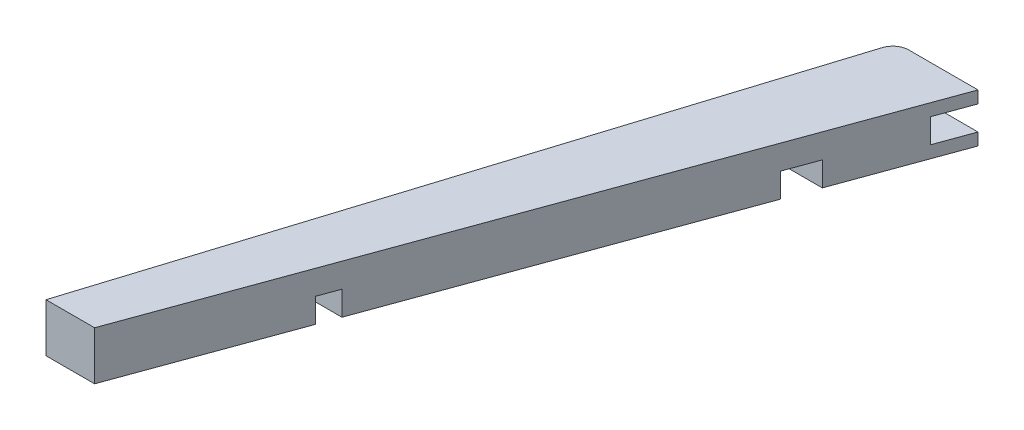
ISO-10303-21;
HEADER;
FILE_DESCRIPTION(('STEP AP214'),'2;1');
FILE_NAME('part.step','',(''),(''),'','','');
FILE_SCHEMA(('AUTOMOTIVE_DESIGN { 1 0 10303 214 1 1 1 1 }'));
ENDSEC;
DATA;
#1=APPLICATION_CONTEXT('core data for automotive mechanical design processes');
#2=APPLICATION_PROTOCOL_DEFINITION('international standard','automotive_design',2000,#1);
#3=PRODUCT_CONTEXT('',#1,'mechanical');
#4=PRODUCT('Part','Part','',(#3));
#5=PRODUCT_RELATED_PRODUCT_CATEGORY('part','',(#4));
#6=PRODUCT_DEFINITION_FORMATION('','',#4);
#7=PRODUCT_DEFINITION_CONTEXT('part definition',#1,'design');
#8=PRODUCT_DEFINITION('design','',#6,#7);
#9=PRODUCT_DEFINITION_SHAPE('','',#8);
#10=(LENGTH_UNIT() NAMED_UNIT(*) SI_UNIT(.MILLI.,.METRE.));
#11=(NAMED_UNIT(*) PLANE_ANGLE_UNIT() SI_UNIT($,.RADIAN.));
#12=(NAMED_UNIT(*) SI_UNIT($,.STERADIAN.) SOLID_ANGLE_UNIT());
#13=UNCERTAINTY_MEASURE_WITH_UNIT(LENGTH_MEASURE(1.E-05),#10,'distance_accuracy_value','');
#14=(GEOMETRIC_REPRESENTATION_CONTEXT(3) GLOBAL_UNCERTAINTY_ASSIGNED_CONTEXT((#13)) GLOBAL_UNIT_ASSIGNED_CONTEXT((#10,
#11,#12)) REPRESENTATION_CONTEXT('',''));
#15=CARTESIAN_POINT('',(0.,0.,0.));
#16=DIRECTION('',(0.,0.,1.));
#17=DIRECTION('',(1.,0.,0.));
#18=AXIS2_PLACEMENT_3D('',#15,#16,#17);
#19=CARTESIAN_POINT('',(-15.,15.,0.));
#20=DIRECTION('',(0.,0.,-1.));
#21=DIRECTION('',(-1.,0.,0.));
#22=AXIS2_PLACEMENT_3D('',#19,#20,#21);
#23=PLANE('',#22);
#24=DIRECTION('',(1.,0.,0.));
#25=VECTOR('',#24,1.);
#26=CARTESIAN_POINT('',(-15.,-15.,0.));
#27=LINE('',#26,#25);
#28=CARTESIAN_POINT('',(-15.,-15.,0.));
#29=VERTEX_POINT('',#28);
#30=CARTESIAN_POINT('',(15.,-15.,0.));
#31=VERTEX_POINT('',#30);
#32=EDGE_CURVE('E231',#29,#31,#27,.T.);
#33=ORIENTED_EDGE('',*,*,#32,.T.);
#34=DIRECTION('',(0.,-1.,0.));
#35=VECTOR('',#34,1.);
#36=CARTESIAN_POINT('',(15.,15.,0.));
#37=LINE('',#36,#35);
#38=CARTESIAN_POINT('',(15.,15.,0.));
#39=VERTEX_POINT('',#38);
#40=EDGE_CURVE('E261',#39,#31,#37,.T.);
#41=ORIENTED_EDGE('',*,*,#40,.F.);
#42=DIRECTION('',(1.,0.,0.));
#43=VECTOR('',#42,1.);
#44=CARTESIAN_POINT('',(-15.,15.,0.));
#45=LINE('',#44,#43);
#46=CARTESIAN_POINT('',(-15.,15.,0.));
#47=VERTEX_POINT('',#46);
#48=EDGE_CURVE('E232',#47,#39,#45,.T.);
#49=ORIENTED_EDGE('',*,*,#48,.F.);
#50=DIRECTION('',(0.,-1.,0.));
#51=VECTOR('',#50,1.);
#52=CARTESIAN_POINT('',(-15.,15.,0.));
#53=LINE('',#52,#51);
#54=EDGE_CURVE('E243',#47,#29,#53,.T.);
#55=ORIENTED_EDGE('',*,*,#54,.T.);
#56=EDGE_LOOP('',(#33,#41,#49,#55));
#57=FACE_BOUND('',#56,.T.);
#58=ADVANCED_FACE('F34',(#57),#23,.F.);
#59=CARTESIAN_POINT('',(15.,15.,0.));
#60=DIRECTION('',(-0.939692620785907,0.,-0.342020143325673));
#61=DIRECTION('',(-0.342020143325673,0.,0.939692620785907));
#62=AXIS2_PLACEMENT_3D('',#59,#60,#61);
#63=PLANE('',#62);
#64=DIRECTION('',(0.342020143325673,0.,-0.939692620785907));
#65=VECTOR('',#64,1.);
#66=CARTESIAN_POINT('',(15.,-15.,0.));
#67=LINE('',#66,#65);
#68=CARTESIAN_POINT('',(51.3970234266207,-15.,-100.));
#69=VERTEX_POINT('',#68);
#70=EDGE_CURVE('E247',#31,#69,#67,.T.);
#71=ORIENTED_EDGE('',*,*,#70,.T.);
#72=DIRECTION('',(0.,1.,0.));
#73=VECTOR('',#72,1.);
#74=CARTESIAN_POINT('',(51.3970234266207,15.,-100.));
#75=LINE('',#74,#73);
#76=CARTESIAN_POINT('',(51.3970234266207,0.,-100.));
#77=VERTEX_POINT('',#76);
#78=EDGE_CURVE('E202',#69,#77,#75,.T.);
#79=ORIENTED_EDGE('',*,*,#78,.T.);
#80=DIRECTION('',(-0.342020143325673,0.,0.939692620785907));
#81=VECTOR('',#80,1.);
#82=CARTESIAN_POINT('',(15.,0.,0.));
#83=LINE('',#82,#81);
#84=CARTESIAN_POINT('',(55.7646662378152,0.,-112.));
#85=VERTEX_POINT('',#84);
#86=EDGE_CURVE('E11',#85,#77,#83,.T.);
#87=ORIENTED_EDGE('',*,*,#86,.F.);
#88=DIRECTION('',(0.,-1.,0.));
#89=VECTOR('',#88,1.);
#90=CARTESIAN_POINT('',(55.7646662378152,15.,-112.));
#91=LINE('',#90,#89);
#92=CARTESIAN_POINT('',(55.7646662378152,-15.,-112.));
#93=VERTEX_POINT('',#92);
#94=EDGE_CURVE('E166',#85,#93,#91,.T.);
#95=ORIENTED_EDGE('',*,*,#94,.T.);
#96=CARTESIAN_POINT('',(128.012757739657,-15.,-310.5));
#97=VERTEX_POINT('',#96);
#98=EDGE_CURVE('E251',#93,#97,#67,.T.);
#99=ORIENTED_EDGE('',*,*,#98,.T.);
#100=DIRECTION('',(0.,1.,0.));
#101=VECTOR('',#100,1.);
#102=CARTESIAN_POINT('',(128.012757739657,15.,-310.5));
#103=LINE('',#102,#101);
#104=CARTESIAN_POINT('',(128.012757739657,0.,-310.5));
#105=VERTEX_POINT('',#104);
#106=EDGE_CURVE('E198',#97,#105,#103,.T.);
#107=ORIENTED_EDGE('',*,*,#106,.T.);
#108=DIRECTION('',(-0.342020143325673,0.,0.939692620785907));
#109=VECTOR('',#108,1.);
#110=CARTESIAN_POINT('',(15.,0.,0.));
#111=LINE('',#110,#109);
#112=CARTESIAN_POINT('',(134.928192190715,0.,-329.5));
#113=VERTEX_POINT('',#112);
#114=EDGE_CURVE('E42',#113,#105,#111,.T.);
#115=ORIENTED_EDGE('',*,*,#114,.F.);
#116=DIRECTION('',(0.,-1.,0.));
#117=VECTOR('',#116,1.);
#118=CARTESIAN_POINT('',(134.928192190715,15.,-329.5));
#119=LINE('',#118,#117);
#120=CARTESIAN_POINT('',(134.928192190715,-15.,-329.5));
#121=VERTEX_POINT('',#120);
#122=EDGE_CURVE('E180',#113,#121,#119,.T.);
#123=ORIENTED_EDGE('',*,*,#122,.T.);
#124=CARTESIAN_POINT('',(160.588093706483,-15.,-400.));
#125=VERTEX_POINT('',#124);
#126=EDGE_CURVE('E246',#121,#125,#67,.T.);
#127=ORIENTED_EDGE('',*,*,#126,.T.);
#128=DIRECTION('',(0.,-1.,0.));
#129=VECTOR('',#128,1.);
#130=CARTESIAN_POINT('',(160.588093706483,15.,-400.));
#131=LINE('',#130,#129);
#132=CARTESIAN_POINT('',(160.588093706483,-7.5,-400.));
#133=VERTEX_POINT('',#132);
#134=EDGE_CURVE('E257',#133,#125,#131,.T.);
#135=ORIENTED_EDGE('',*,*,#134,.F.);
#136=DIRECTION('',(-0.342020143325673,0.,0.939692620785907));
#137=VECTOR('',#136,1.);
#138=CARTESIAN_POINT('',(15.,-7.5,0.));
#139=LINE('',#138,#137);
#140=CARTESIAN_POINT('',(152.744535158046,-7.5,-378.45));
#141=VERTEX_POINT('',#140);
#142=EDGE_CURVE('E224',#133,#141,#139,.T.);
#143=ORIENTED_EDGE('',*,*,#142,.T.);
#144=DIRECTION('',(0.,-1.,0.));
#145=VECTOR('',#144,1.);
#146=CARTESIAN_POINT('',(152.744535158046,15.,-378.45));
#147=LINE('',#146,#145);
#148=CARTESIAN_POINT('',(152.744535158046,7.5,-378.45));
#149=VERTEX_POINT('',#148);
#150=EDGE_CURVE('E264',#149,#141,#147,.T.);
#151=ORIENTED_EDGE('',*,*,#150,.F.);
#152=DIRECTION('',(0.342020143325673,0.,-0.939692620785907));
#153=VECTOR('',#152,1.);
#154=CARTESIAN_POINT('',(15.,7.5,0.));
#155=LINE('',#154,#153);
#156=CARTESIAN_POINT('',(160.588093706483,7.5,-400.));
#157=VERTEX_POINT('',#156);
#158=EDGE_CURVE('E228',#149,#157,#155,.T.);
#159=ORIENTED_EDGE('',*,*,#158,.T.);
#160=CARTESIAN_POINT('',(160.588093706483,15.,-400.));
#161=VERTEX_POINT('',#160);
#162=EDGE_CURVE('E258',#161,#157,#131,.T.);
#163=ORIENTED_EDGE('',*,*,#162,.F.);
#164=DIRECTION('',(0.342020143325673,0.,-0.939692620785907));
#165=VECTOR('',#164,1.);
#166=CARTESIAN_POINT('',(15.,15.,0.));
#167=LINE('',#166,#165);
#168=EDGE_CURVE('E235',#39,#161,#167,.T.);
#169=ORIENTED_EDGE('',*,*,#168,.F.);
#170=ORIENTED_EDGE('',*,*,#40,.T.);
#171=EDGE_LOOP('',(#71,#79,#87,#95,#99,#107,#115,#123,#127,#135,#143,#151,#159,#163,#169,#170));
#172=FACE_BOUND('',#171,.T.);
#173=ADVANCED_FACE('F290',(#172),#63,.F.);
#174=CARTESIAN_POINT('',(160.588093706483,15.,-400.));
#175=DIRECTION('',(0.,0.,1.));
#176=DIRECTION('',(1.,0.,0.));
#177=AXIS2_PLACEMENT_3D('',#174,#175,#176);
#178=PLANE('',#177);
#179=DIRECTION('',(-1.,0.,0.));
#180=VECTOR('',#179,1.);
#181=CARTESIAN_POINT('',(160.588093706483,-15.,-400.));
#182=LINE('',#181,#180);
#183=CARTESIAN_POINT('',(117.929695233117,-15.,-400.));
#184=VERTEX_POINT('',#183);
#185=EDGE_CURVE('E250',#125,#184,#182,.T.);
#186=ORIENTED_EDGE('',*,*,#185,.T.);
#187=DIRECTION('',(0.,-1.,0.));
#188=VECTOR('',#187,1.);
#189=CARTESIAN_POINT('',(117.929695233117,15.,-400.));
#190=LINE('',#189,#188);
#191=CARTESIAN_POINT('',(117.929695233117,15.,-400.));
#192=VERTEX_POINT('',#191);
#193=EDGE_CURVE('E271',#184,#192,#190,.F.);
#194=ORIENTED_EDGE('',*,*,#193,.T.);
#195=DIRECTION('',(-1.,0.,0.));
#196=VECTOR('',#195,1.);
#197=CARTESIAN_POINT('',(160.588093706483,15.,-400.));
#198=LINE('',#197,#196);
#199=EDGE_CURVE('E238',#161,#192,#198,.T.);
#200=ORIENTED_EDGE('',*,*,#199,.F.);
#201=ORIENTED_EDGE('',*,*,#162,.T.);
#202=DIRECTION('',(1.,0.,0.));
#203=VECTOR('',#202,1.);
#204=CARTESIAN_POINT('',(160.588093706483,7.5,-400.));
#205=LINE('',#204,#203);
#206=CARTESIAN_POINT('',(135.588093706483,7.5,-400.));
#207=VERTEX_POINT('',#206);
#208=EDGE_CURVE('E209',#207,#157,#205,.T.);
#209=ORIENTED_EDGE('',*,*,#208,.F.);
#210=DIRECTION('',(0.,1.,0.));
#211=VECTOR('',#210,1.);
#212=CARTESIAN_POINT('',(135.588093706483,7.5,-400.));
#213=LINE('',#212,#211);
#214=CARTESIAN_POINT('',(135.588093706483,-7.5,-400.));
#215=VERTEX_POINT('',#214);
#216=EDGE_CURVE('E218',#215,#207,#213,.T.);
#217=ORIENTED_EDGE('',*,*,#216,.F.);
#218=DIRECTION('',(-1.,0.,0.));
#219=VECTOR('',#218,1.);
#220=CARTESIAN_POINT('',(160.588093706483,-7.5,-400.));
#221=LINE('',#220,#219);
#222=EDGE_CURVE('E205',#133,#215,#221,.T.);
#223=ORIENTED_EDGE('',*,*,#222,.F.);
#224=ORIENTED_EDGE('',*,*,#134,.T.);
#225=EDGE_LOOP('',(#186,#194,#200,#201,#209,#217,#223,#224));
#226=FACE_BOUND('',#225,.T.);
#227=ADVANCED_FACE('F300',(#226),#178,.F.);
#228=CARTESIAN_POINT('',(110.588093706483,15.,-400.));
#229=DIRECTION('',(0.954079771438947,0.,0.299552649347335));
#230=DIRECTION('',(0.299552649347335,0.,-0.954079771438947));
#231=AXIS2_PLACEMENT_3D('',#228,#229,#230);
#232=PLANE('',#231);
#233=DIRECTION('',(-0.299552649347335,0.,0.954079771438947));
#234=VECTOR('',#233,1.);
#235=CARTESIAN_POINT('',(110.588093706483,15.,-400.));
#236=LINE('',#235,#234);
#237=CARTESIAN_POINT('',(108.388897518727,15.,-392.995526493473));
#238=VERTEX_POINT('',#237);
#239=EDGE_CURVE('E241',#238,#47,#236,.T.);
#240=ORIENTED_EDGE('',*,*,#239,.F.);
#241=DIRECTION('',(0.,-1.,0.));
#242=VECTOR('',#241,1.);
#243=CARTESIAN_POINT('',(108.388897518727,15.,-392.995526493473));
#244=LINE('',#243,#242);
#245=CARTESIAN_POINT('',(108.388897518727,-15.,-392.995526493473));
#246=VERTEX_POINT('',#245);
#247=EDGE_CURVE('E266',#238,#246,#244,.T.);
#248=ORIENTED_EDGE('',*,*,#247,.T.);
#249=DIRECTION('',(-0.299552649347335,0.,0.954079771438947));
#250=VECTOR('',#249,1.);
#251=CARTESIAN_POINT('',(110.588093706483,-15.,-400.));
#252=LINE('',#251,#250);
#253=EDGE_CURVE('E236',#246,#29,#252,.T.);
#254=ORIENTED_EDGE('',*,*,#253,.T.);
#255=ORIENTED_EDGE('',*,*,#54,.F.);
#256=EDGE_LOOP('',(#240,#248,#254,#255));
#257=FACE_BOUND('',#256,.T.);
#258=ADVANCED_FACE('F312',(#257),#232,.F.);
#259=CARTESIAN_POINT('',(0.,15.,0.));
#260=DIRECTION('',(0.,-1.,0.));
#261=DIRECTION('',(0.,0.,-1.));
#262=AXIS2_PLACEMENT_3D('',#259,#260,#261);
#263=PLANE('',#262);
#264=ORIENTED_EDGE('',*,*,#199,.T.);
#265=CARTESIAN_POINT('',(117.929695233117,15.,-390.));
#266=DIRECTION('',(0.,-1.,0.));
#267=DIRECTION('',(0.,0.,-1.));
#268=AXIS2_PLACEMENT_3D('',#265,#266,#267);
#269=CIRCLE('',#268,10.);
#270=EDGE_CURVE('E273',#192,#238,#269,.F.);
#271=ORIENTED_EDGE('',*,*,#270,.T.);
#272=ORIENTED_EDGE('',*,*,#239,.T.);
#273=ORIENTED_EDGE('',*,*,#48,.T.);
#274=ORIENTED_EDGE('',*,*,#168,.T.);
#275=EDGE_LOOP('',(#264,#271,#272,#273,#274));
#276=FACE_BOUND('',#275,.T.);
#277=ADVANCED_FACE('F316',(#276),#263,.F.);
#278=CARTESIAN_POINT('',(0.,-15.,0.));
#279=DIRECTION('',(0.,-1.,0.));
#280=DIRECTION('',(0.,0.,-1.));
#281=AXIS2_PLACEMENT_3D('',#278,#279,#280);
#282=PLANE('',#281);
#283=DIRECTION('',(-1.,0.,0.));
#284=VECTOR('',#283,1.);
#285=CARTESIAN_POINT('',(0.,-15.,-100.));
#286=LINE('',#285,#284);
#287=CARTESIAN_POINT('',(33.5808448322179,-15.,-100.));
#288=VERTEX_POINT('',#287);
#289=EDGE_CURVE('E277',#69,#288,#286,.T.);
#290=ORIENTED_EDGE('',*,*,#289,.F.);
#291=ORIENTED_EDGE('',*,*,#70,.F.);
#292=ORIENTED_EDGE('',*,*,#32,.F.);
#293=ORIENTED_EDGE('',*,*,#253,.F.);
#294=CARTESIAN_POINT('',(117.929695233117,-15.,-390.));
#295=DIRECTION('',(0.,-1.,0.));
#296=DIRECTION('',(0.,0.,-1.));
#297=AXIS2_PLACEMENT_3D('',#294,#295,#296);
#298=CIRCLE('',#297,10.);
#299=EDGE_CURVE('E269',#246,#184,#298,.T.);
#300=ORIENTED_EDGE('',*,*,#299,.T.);
#301=ORIENTED_EDGE('',*,*,#185,.F.);
#302=ORIENTED_EDGE('',*,*,#126,.F.);
#303=DIRECTION('',(1.,0.,0.));
#304=VECTOR('',#303,1.);
#305=CARTESIAN_POINT('',(111.470474965186,-15.,-329.5));
#306=LINE('',#305,#304);
#307=CARTESIAN_POINT('',(111.470474965186,-15.,-329.5));
#308=VERTEX_POINT('',#307);
#309=EDGE_CURVE('E186',#308,#121,#306,.T.);
#310=ORIENTED_EDGE('',*,*,#309,.F.);
#311=DIRECTION('',(0.,0.,-1.));
#312=VECTOR('',#311,1.);
#313=CARTESIAN_POINT('',(111.470474965186,-15.,-310.5));
#314=LINE('',#313,#312);
#315=CARTESIAN_POINT('',(111.470474965186,-15.,-310.5));
#316=VERTEX_POINT('',#315);
#317=EDGE_CURVE('E57',#316,#308,#314,.T.);
#318=ORIENTED_EDGE('',*,*,#317,.F.);
#319=DIRECTION('',(-1.,0.,0.));
#320=VECTOR('',#319,1.);
#321=CARTESIAN_POINT('',(0.,-15.,-310.5));
#322=LINE('',#321,#320);
#323=EDGE_CURVE('E275',#97,#316,#322,.T.);
#324=ORIENTED_EDGE('',*,*,#323,.F.);
#325=ORIENTED_EDGE('',*,*,#98,.F.);
#326=DIRECTION('',(1.,0.,0.));
#327=VECTOR('',#326,1.);
#328=CARTESIAN_POINT('',(33.5808448322179,-15.,-112.));
#329=LINE('',#328,#327);
#330=CARTESIAN_POINT('',(33.5808448322179,-15.,-112.));
#331=VERTEX_POINT('',#330);
#332=EDGE_CURVE('E173',#331,#93,#329,.T.);
#333=ORIENTED_EDGE('',*,*,#332,.F.);
#334=DIRECTION('',(0.,0.,-1.));
#335=VECTOR('',#334,1.);
#336=CARTESIAN_POINT('',(33.5808448322179,-15.,-100.));
#337=LINE('',#336,#335);
#338=EDGE_CURVE('E49',#288,#331,#337,.T.);
#339=ORIENTED_EDGE('',*,*,#338,.F.);
#340=EDGE_LOOP('',(#290,#291,#292,#293,#300,#301,#302,#310,#318,#324,#325,#333,#339));
#341=FACE_BOUND('',#340,.T.);
#342=ADVANCED_FACE('F304',(#341),#282,.T.);
#343=CARTESIAN_POINT('',(0.,0.,-378.45));
#344=DIRECTION('',(0.,0.,-1.));
#345=DIRECTION('',(-1.,0.,0.));
#346=AXIS2_PLACEMENT_3D('',#343,#344,#345);
#347=PLANE('',#346);
#348=ORIENTED_EDGE('',*,*,#150,.T.);
#349=DIRECTION('',(-1.,0.,0.));
#350=VECTOR('',#349,1.);
#351=CARTESIAN_POINT('',(160.588093706483,-7.5,-378.45));
#352=LINE('',#351,#350);
#353=CARTESIAN_POINT('',(135.588093706483,-7.5,-378.45));
#354=VERTEX_POINT('',#353);
#355=EDGE_CURVE('E206',#141,#354,#352,.T.);
#356=ORIENTED_EDGE('',*,*,#355,.T.);
#357=DIRECTION('',(0.,1.,0.));
#358=VECTOR('',#357,1.);
#359=CARTESIAN_POINT('',(135.588093706483,7.5,-378.45));
#360=LINE('',#359,#358);
#361=CARTESIAN_POINT('',(135.588093706483,7.5,-378.45));
#362=VERTEX_POINT('',#361);
#363=EDGE_CURVE('E208',#354,#362,#360,.T.);
#364=ORIENTED_EDGE('',*,*,#363,.T.);
#365=DIRECTION('',(1.,0.,0.));
#366=VECTOR('',#365,1.);
#367=CARTESIAN_POINT('',(160.588093706483,7.5,-378.45));
#368=LINE('',#367,#366);
#369=EDGE_CURVE('E212',#362,#149,#368,.T.);
#370=ORIENTED_EDGE('',*,*,#369,.T.);
#371=EDGE_LOOP('',(#348,#356,#364,#370));
#372=FACE_BOUND('',#371,.T.);
#373=ADVANCED_FACE('F326',(#372),#347,.T.);
#374=CARTESIAN_POINT('',(160.588093706483,7.5,-378.45));
#375=DIRECTION('',(0.,1.,0.));
#376=DIRECTION('',(0.,0.,1.));
#377=AXIS2_PLACEMENT_3D('',#374,#375,#376);
#378=PLANE('',#377);
#379=ORIENTED_EDGE('',*,*,#369,.F.);
#380=DIRECTION('',(0.,0.,-1.));
#381=VECTOR('',#380,1.);
#382=CARTESIAN_POINT('',(135.588093706483,7.5,-378.45));
#383=LINE('',#382,#381);
#384=EDGE_CURVE('E222',#362,#207,#383,.T.);
#385=ORIENTED_EDGE('',*,*,#384,.T.);
#386=ORIENTED_EDGE('',*,*,#208,.T.);
#387=ORIENTED_EDGE('',*,*,#158,.F.);
#388=EDGE_LOOP('',(#379,#385,#386,#387));
#389=FACE_BOUND('',#388,.T.);
#390=ADVANCED_FACE('F324',(#389),#378,.F.);
#391=CARTESIAN_POINT('',(160.588093706483,-7.5,-378.45));
#392=DIRECTION('',(0.,-1.,0.));
#393=DIRECTION('',(0.,0.,-1.));
#394=AXIS2_PLACEMENT_3D('',#391,#392,#393);
#395=PLANE('',#394);
#396=ORIENTED_EDGE('',*,*,#222,.T.);
#397=DIRECTION('',(0.,0.,-1.));
#398=VECTOR('',#397,1.);
#399=CARTESIAN_POINT('',(135.588093706483,-7.5,-378.45));
#400=LINE('',#399,#398);
#401=EDGE_CURVE('E215',#354,#215,#400,.T.);
#402=ORIENTED_EDGE('',*,*,#401,.F.);
#403=ORIENTED_EDGE('',*,*,#355,.F.);
#404=ORIENTED_EDGE('',*,*,#142,.F.);
#405=EDGE_LOOP('',(#396,#402,#403,#404));
#406=FACE_BOUND('',#405,.T.);
#407=ADVANCED_FACE('F333',(#406),#395,.F.);
#408=CARTESIAN_POINT('',(135.588093706483,7.5,-378.45));
#409=DIRECTION('',(-1.,0.,0.));
#410=DIRECTION('',(0.,0.,1.));
#411=AXIS2_PLACEMENT_3D('',#408,#409,#410);
#412=PLANE('',#411);
#413=ORIENTED_EDGE('',*,*,#216,.T.);
#414=ORIENTED_EDGE('',*,*,#384,.F.);
#415=ORIENTED_EDGE('',*,*,#363,.F.);
#416=ORIENTED_EDGE('',*,*,#401,.T.);
#417=EDGE_LOOP('',(#413,#414,#415,#416));
#418=FACE_BOUND('',#417,.T.);
#419=ADVANCED_FACE('F331',(#418),#412,.F.);
#420=CARTESIAN_POINT('',(117.929695233117,15.,-390.));
#421=DIRECTION('',(0.,-1.,0.));
#422=DIRECTION('',(0.,0.,-1.));
#423=AXIS2_PLACEMENT_3D('',#420,#421,#422);
#424=CYLINDRICAL_SURFACE('',#423,10.);
#425=ORIENTED_EDGE('',*,*,#270,.F.);
#426=ORIENTED_EDGE('',*,*,#193,.F.);
#427=ORIENTED_EDGE('',*,*,#299,.F.);
#428=ORIENTED_EDGE('',*,*,#247,.F.);
#429=EDGE_LOOP('',(#425,#426,#427,#428));
#430=FACE_BOUND('',#429,.T.);
#431=ADVANCED_FACE('F36',(#430),#424,.T.);
#432=CARTESIAN_POINT('',(0.,0.,0.));
#433=DIRECTION('',(0.,-1.,0.));
#434=DIRECTION('',(0.,0.,-1.));
#435=AXIS2_PLACEMENT_3D('',#432,#433,#434);
#436=PLANE('',#435);
#437=ORIENTED_EDGE('',*,*,#114,.T.);
#438=DIRECTION('',(-1.,0.,0.));
#439=VECTOR('',#438,1.);
#440=CARTESIAN_POINT('',(151.470474965186,0.,-310.5));
#441=LINE('',#440,#439);
#442=CARTESIAN_POINT('',(111.470474965186,0.,-310.5));
#443=VERTEX_POINT('',#442);
#444=EDGE_CURVE('E189',#105,#443,#441,.T.);
#445=ORIENTED_EDGE('',*,*,#444,.T.);
#446=DIRECTION('',(0.,0.,-1.));
#447=VECTOR('',#446,1.);
#448=CARTESIAN_POINT('',(111.470474965186,0.,-310.5));
#449=LINE('',#448,#447);
#450=CARTESIAN_POINT('',(111.470474965186,0.,-329.5));
#451=VERTEX_POINT('',#450);
#452=EDGE_CURVE('E182',#443,#451,#449,.T.);
#453=ORIENTED_EDGE('',*,*,#452,.T.);
#454=DIRECTION('',(1.,0.,0.));
#455=VECTOR('',#454,1.);
#456=CARTESIAN_POINT('',(111.470474965186,0.,-329.5));
#457=LINE('',#456,#455);
#458=EDGE_CURVE('E185',#451,#113,#457,.T.);
#459=ORIENTED_EDGE('',*,*,#458,.T.);
#460=EDGE_LOOP('',(#437,#445,#453,#459));
#461=FACE_BOUND('',#460,.T.);
#462=ADVANCED_FACE('F281',(#461),#436,.T.);
#463=CARTESIAN_POINT('',(151.470474965186,0.,-310.5));
#464=DIRECTION('',(0.,0.,1.));
#465=DIRECTION('',(1.,0.,0.));
#466=AXIS2_PLACEMENT_3D('',#463,#464,#465);
#467=PLANE('',#466);
#468=ORIENTED_EDGE('',*,*,#323,.T.);
#469=DIRECTION('',(0.,-1.,0.));
#470=VECTOR('',#469,1.);
#471=CARTESIAN_POINT('',(111.470474965186,0.,-310.5));
#472=LINE('',#471,#470);
#473=EDGE_CURVE('E178',#443,#316,#472,.T.);
#474=ORIENTED_EDGE('',*,*,#473,.F.);
#475=ORIENTED_EDGE('',*,*,#444,.F.);
#476=ORIENTED_EDGE('',*,*,#106,.F.);
#477=EDGE_LOOP('',(#468,#474,#475,#476));
#478=FACE_BOUND('',#477,.T.);
#479=ADVANCED_FACE('F286',(#478),#467,.F.);
#480=CARTESIAN_POINT('',(111.470474965186,0.,-329.5));
#481=DIRECTION('',(0.,0.,-1.));
#482=DIRECTION('',(-1.,0.,0.));
#483=AXIS2_PLACEMENT_3D('',#480,#481,#482);
#484=PLANE('',#483);
#485=ORIENTED_EDGE('',*,*,#458,.F.);
#486=DIRECTION('',(0.,-1.,0.));
#487=VECTOR('',#486,1.);
#488=CARTESIAN_POINT('',(111.470474965186,0.,-329.5));
#489=LINE('',#488,#487);
#490=EDGE_CURVE('E191',#451,#308,#489,.T.);
#491=ORIENTED_EDGE('',*,*,#490,.T.);
#492=ORIENTED_EDGE('',*,*,#309,.T.);
#493=ORIENTED_EDGE('',*,*,#122,.F.);
#494=EDGE_LOOP('',(#485,#491,#492,#493));
#495=FACE_BOUND('',#494,.T.);
#496=ADVANCED_FACE('F428',(#495),#484,.F.);
#497=CARTESIAN_POINT('',(111.470474965186,0.,-310.5));
#498=DIRECTION('',(-1.,0.,0.));
#499=DIRECTION('',(0.,0.,1.));
#500=AXIS2_PLACEMENT_3D('',#497,#498,#499);
#501=PLANE('',#500);
#502=ORIENTED_EDGE('',*,*,#317,.T.);
#503=ORIENTED_EDGE('',*,*,#490,.F.);
#504=ORIENTED_EDGE('',*,*,#452,.F.);
#505=ORIENTED_EDGE('',*,*,#473,.T.);
#506=EDGE_LOOP('',(#502,#503,#504,#505));
#507=FACE_BOUND('',#506,.T.);
#508=ADVANCED_FACE('F435',(#507),#501,.F.);
#509=CARTESIAN_POINT('',(0.,0.,0.));
#510=DIRECTION('',(0.,-1.,0.));
#511=DIRECTION('',(0.,0.,-1.));
#512=AXIS2_PLACEMENT_3D('',#509,#510,#511);
#513=PLANE('',#512);
#514=ORIENTED_EDGE('',*,*,#86,.T.);
#515=DIRECTION('',(-1.,0.,0.));
#516=VECTOR('',#515,1.);
#517=CARTESIAN_POINT('',(73.580844832218,0.,-100.));
#518=LINE('',#517,#516);
#519=CARTESIAN_POINT('',(33.5808448322179,0.,-100.));
#520=VERTEX_POINT('',#519);
#521=EDGE_CURVE('E160',#77,#520,#518,.T.);
#522=ORIENTED_EDGE('',*,*,#521,.T.);
#523=DIRECTION('',(0.,0.,-1.));
#524=VECTOR('',#523,1.);
#525=CARTESIAN_POINT('',(33.5808448322179,0.,-100.));
#526=LINE('',#525,#524);
#527=CARTESIAN_POINT('',(33.5808448322179,0.,-112.));
#528=VERTEX_POINT('',#527);
#529=EDGE_CURVE('E156',#520,#528,#526,.T.);
#530=ORIENTED_EDGE('',*,*,#529,.T.);
#531=DIRECTION('',(1.,0.,0.));
#532=VECTOR('',#531,1.);
#533=CARTESIAN_POINT('',(33.5808448322179,0.,-112.));
#534=LINE('',#533,#532);
#535=EDGE_CURVE('E163',#528,#85,#534,.T.);
#536=ORIENTED_EDGE('',*,*,#535,.T.);
#537=EDGE_LOOP('',(#514,#522,#530,#536));
#538=FACE_BOUND('',#537,.T.);
#539=ADVANCED_FACE('F170',(#538),#513,.T.);
#540=CARTESIAN_POINT('',(73.580844832218,0.,-100.));
#541=DIRECTION('',(0.,0.,1.));
#542=DIRECTION('',(1.,0.,0.));
#543=AXIS2_PLACEMENT_3D('',#540,#541,#542);
#544=PLANE('',#543);
#545=ORIENTED_EDGE('',*,*,#289,.T.);
#546=DIRECTION('',(0.,-1.,0.));
#547=VECTOR('',#546,1.);
#548=CARTESIAN_POINT('',(33.5808448322179,0.,-100.));
#549=LINE('',#548,#547);
#550=EDGE_CURVE('E159',#520,#288,#549,.T.);
#551=ORIENTED_EDGE('',*,*,#550,.F.);
#552=ORIENTED_EDGE('',*,*,#521,.F.);
#553=ORIENTED_EDGE('',*,*,#78,.F.);
#554=EDGE_LOOP('',(#545,#551,#552,#553));
#555=FACE_BOUND('',#554,.T.);
#556=ADVANCED_FACE('F449',(#555),#544,.F.);
#557=CARTESIAN_POINT('',(33.5808448322179,0.,-112.));
#558=DIRECTION('',(0.,0.,-1.));
#559=DIRECTION('',(-1.,0.,0.));
#560=AXIS2_PLACEMENT_3D('',#557,#558,#559);
#561=PLANE('',#560);
#562=ORIENTED_EDGE('',*,*,#535,.F.);
#563=DIRECTION('',(0.,-1.,0.));
#564=VECTOR('',#563,1.);
#565=CARTESIAN_POINT('',(33.5808448322179,0.,-112.));
#566=LINE('',#565,#564);
#567=EDGE_CURVE('E152',#528,#331,#566,.T.);
#568=ORIENTED_EDGE('',*,*,#567,.T.);
#569=ORIENTED_EDGE('',*,*,#332,.T.);
#570=ORIENTED_EDGE('',*,*,#94,.F.);
#571=EDGE_LOOP('',(#562,#568,#569,#570));
#572=FACE_BOUND('',#571,.T.);
#573=ADVANCED_FACE('F164',(#572),#561,.F.);
#574=CARTESIAN_POINT('',(33.5808448322179,0.,-100.));
#575=DIRECTION('',(-1.,0.,0.));
#576=DIRECTION('',(0.,0.,1.));
#577=AXIS2_PLACEMENT_3D('',#574,#575,#576);
#578=PLANE('',#577);
#579=ORIENTED_EDGE('',*,*,#338,.T.);
#580=ORIENTED_EDGE('',*,*,#567,.F.);
#581=ORIENTED_EDGE('',*,*,#529,.F.);
#582=ORIENTED_EDGE('',*,*,#550,.T.);
#583=EDGE_LOOP('',(#579,#580,#581,#582));
#584=FACE_BOUND('',#583,.T.);
#585=ADVANCED_FACE('F154',(#584),#578,.F.);
#586=CLOSED_SHELL('',(#58,#173,#227,#258,#277,#342,#373,#390,#407,#419,#431,#462,#479,#496,#508,
#539,#556,#573,#585));
#587=MANIFOLD_SOLID_BREP('B2',#586);
#588=ADVANCED_BREP_SHAPE_REPRESENTATION('',(#18,#587),#14);
#589=SHAPE_DEFINITION_REPRESENTATION(#9,#588);
ENDSEC;
END-ISO-10303-21;
